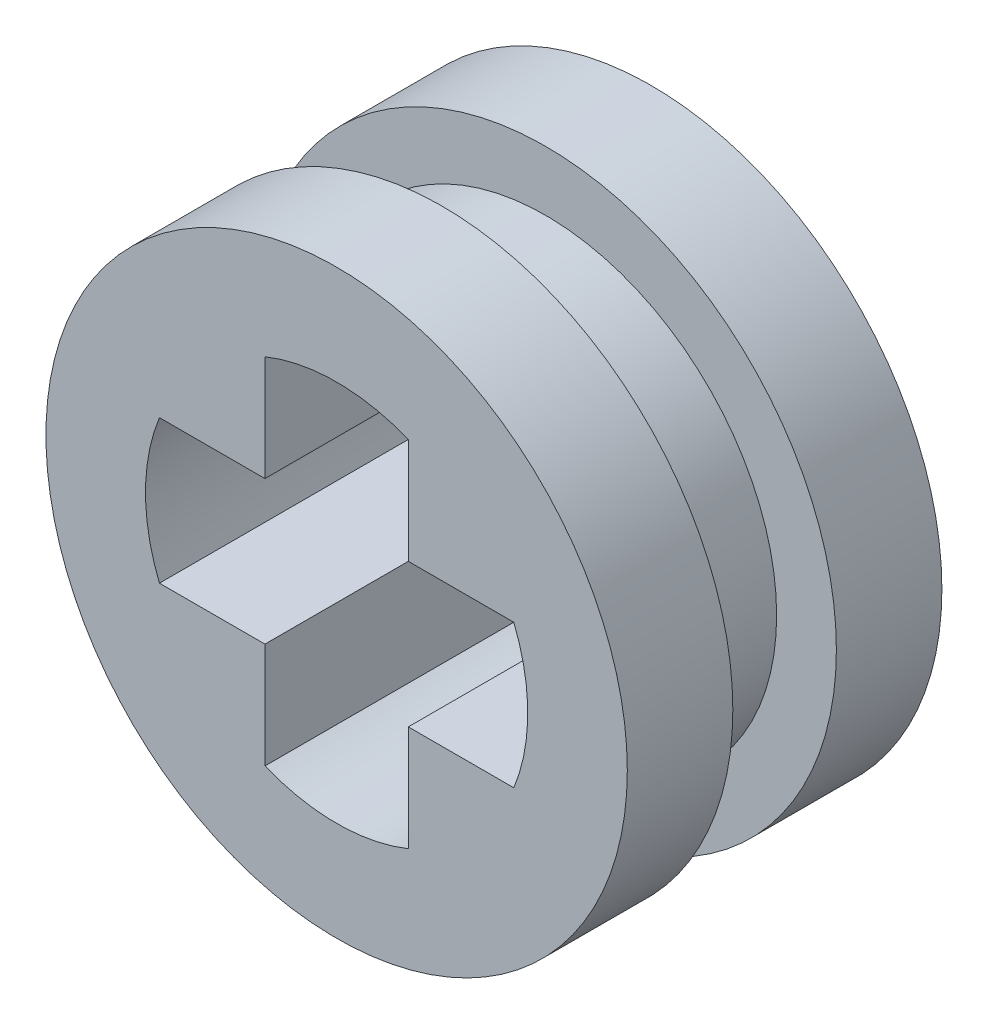
ISO-10303-21;
HEADER;
FILE_DESCRIPTION(('STEP AP214'),'2;1');
FILE_NAME('part.step','',(''),(''),'','','');
FILE_SCHEMA(('AUTOMOTIVE_DESIGN { 1 0 10303 214 1 1 1 1 }'));
ENDSEC;
DATA;
#1=APPLICATION_CONTEXT('core data for automotive mechanical design processes');
#2=APPLICATION_PROTOCOL_DEFINITION('international standard','automotive_design',2000,#1);
#3=PRODUCT_CONTEXT('',#1,'mechanical');
#4=PRODUCT('Part','Part','',(#3));
#5=PRODUCT_RELATED_PRODUCT_CATEGORY('part','',(#4));
#6=PRODUCT_DEFINITION_FORMATION('','',#4);
#7=PRODUCT_DEFINITION_CONTEXT('part definition',#1,'design');
#8=PRODUCT_DEFINITION('design','',#6,#7);
#9=PRODUCT_DEFINITION_SHAPE('','',#8);
#10=(LENGTH_UNIT() NAMED_UNIT(*) SI_UNIT(.MILLI.,.METRE.));
#11=(NAMED_UNIT(*) PLANE_ANGLE_UNIT() SI_UNIT($,.RADIAN.));
#12=(NAMED_UNIT(*) SI_UNIT($,.STERADIAN.) SOLID_ANGLE_UNIT());
#13=UNCERTAINTY_MEASURE_WITH_UNIT(LENGTH_MEASURE(1.E-05),#10,'distance_accuracy_value','');
#14=(GEOMETRIC_REPRESENTATION_CONTEXT(3) GLOBAL_UNCERTAINTY_ASSIGNED_CONTEXT((#13)) GLOBAL_UNIT_ASSIGNED_CONTEXT((#10,
#11,#12)) REPRESENTATION_CONTEXT('',''));
#15=CARTESIAN_POINT('',(0.,0.,0.));
#16=DIRECTION('',(0.,0.,1.));
#17=DIRECTION('',(1.,0.,0.));
#18=AXIS2_PLACEMENT_3D('',#15,#16,#17);
#19=CARTESIAN_POINT('',(0.,0.,1.975));
#20=DIRECTION('',(0.,0.,-1.));
#21=DIRECTION('',(-1.,0.,0.));
#22=AXIS2_PLACEMENT_3D('',#19,#20,#21);
#23=CYLINDRICAL_SURFACE('',#22,3.65);
#24=CARTESIAN_POINT('',(0.,0.,-1.975));
#25=DIRECTION('',(0.,0.,1.));
#26=DIRECTION('',(1.,0.,0.));
#27=AXIS2_PLACEMENT_3D('',#24,#25,#26);
#28=CIRCLE('',#27,3.65);
#29=CARTESIAN_POINT('',(3.65,0.,-1.975));
#30=VERTEX_POINT('',#29);
#31=EDGE_CURVE('E194',#30,#30,#28,.T.);
#32=ORIENTED_EDGE('',*,*,#31,.T.);
#33=EDGE_LOOP('',(#32));
#34=FACE_BOUND('',#33,.T.);
#35=CARTESIAN_POINT('',(0.,0.,-0.65));
#36=DIRECTION('',(0.,0.,1.));
#37=DIRECTION('',(1.,0.,0.));
#38=AXIS2_PLACEMENT_3D('',#35,#36,#37);
#39=CIRCLE('',#38,3.65);
#40=CARTESIAN_POINT('',(3.65,0.,-0.65));
#41=VERTEX_POINT('',#40);
#42=EDGE_CURVE('E40',#41,#41,#39,.T.);
#43=ORIENTED_EDGE('',*,*,#42,.F.);
#44=EDGE_LOOP('',(#43));
#45=FACE_BOUND('',#44,.T.);
#46=ADVANCED_FACE('F36',(#34,#45),#23,.T.);
#47=CARTESIAN_POINT('',(0.,0.9,1.975));
#48=DIRECTION('',(0.,1.,0.));
#49=DIRECTION('',(0.,0.,1.));
#50=AXIS2_PLACEMENT_3D('',#47,#48,#49);
#51=PLANE('',#50);
#52=DIRECTION('',(1.,0.,0.));
#53=VECTOR('',#52,1.);
#54=CARTESIAN_POINT('',(0.,0.9,-1.975));
#55=LINE('',#54,#53);
#56=CARTESIAN_POINT('',(0.9,0.9,-1.975));
#57=VERTEX_POINT('',#56);
#58=CARTESIAN_POINT('',(2.2248595461287,0.9,-1.975));
#59=VERTEX_POINT('',#58);
#60=EDGE_CURVE('E163',#57,#59,#55,.T.);
#61=ORIENTED_EDGE('',*,*,#60,.T.);
#62=DIRECTION('',(0.,0.,-1.));
#63=VECTOR('',#62,1.);
#64=CARTESIAN_POINT('',(2.2248595461287,0.9,1.975));
#65=LINE('',#64,#63);
#66=CARTESIAN_POINT('',(2.2248595461287,0.9,1.975));
#67=VERTEX_POINT('',#66);
#68=EDGE_CURVE('E12',#67,#59,#65,.T.);
#69=ORIENTED_EDGE('',*,*,#68,.F.);
#70=DIRECTION('',(1.,0.,0.));
#71=VECTOR('',#70,1.);
#72=CARTESIAN_POINT('',(0.,0.9,1.975));
#73=LINE('',#72,#71);
#74=CARTESIAN_POINT('',(0.9,0.9,1.975));
#75=VERTEX_POINT('',#74);
#76=EDGE_CURVE('E104',#75,#67,#73,.T.);
#77=ORIENTED_EDGE('',*,*,#76,.F.);
#78=DIRECTION('',(0.,0.,-1.));
#79=VECTOR('',#78,1.);
#80=CARTESIAN_POINT('',(0.9,0.9,1.975));
#81=LINE('',#80,#79);
#82=EDGE_CURVE('E55',#75,#57,#81,.T.);
#83=ORIENTED_EDGE('',*,*,#82,.T.);
#84=EDGE_LOOP('',(#61,#69,#77,#83));
#85=FACE_BOUND('',#84,.T.);
#86=ADVANCED_FACE('F38',(#85),#51,.F.);
#87=CARTESIAN_POINT('',(0.,0.,1.975));
#88=DIRECTION('',(0.,0.,-1.));
#89=DIRECTION('',(-1.,0.,0.));
#90=AXIS2_PLACEMENT_3D('',#87,#88,#89);
#91=CYLINDRICAL_SURFACE('',#90,2.4);
#92=CARTESIAN_POINT('',(0.,0.,-1.975));
#93=DIRECTION('',(0.,0.,1.));
#94=DIRECTION('',(1.,0.,0.));
#95=AXIS2_PLACEMENT_3D('',#92,#93,#94);
#96=CIRCLE('',#95,2.4);
#97=CARTESIAN_POINT('',(2.2248595461287,-0.9,-1.975));
#98=VERTEX_POINT('',#97);
#99=EDGE_CURVE('E165',#98,#59,#96,.T.);
#100=ORIENTED_EDGE('',*,*,#99,.F.);
#101=DIRECTION('',(0.,0.,-1.));
#102=VECTOR('',#101,1.);
#103=CARTESIAN_POINT('',(2.2248595461287,-0.9,1.975));
#104=LINE('',#103,#102);
#105=CARTESIAN_POINT('',(2.2248595461287,-0.9,1.975));
#106=VERTEX_POINT('',#105);
#107=EDGE_CURVE('E46',#106,#98,#104,.T.);
#108=ORIENTED_EDGE('',*,*,#107,.F.);
#109=CARTESIAN_POINT('',(0.,0.,1.975));
#110=DIRECTION('',(0.,0.,1.));
#111=DIRECTION('',(1.,0.,0.));
#112=AXIS2_PLACEMENT_3D('',#109,#110,#111);
#113=CIRCLE('',#112,2.4);
#114=EDGE_CURVE('E227',#106,#67,#113,.T.);
#115=ORIENTED_EDGE('',*,*,#114,.T.);
#116=ORIENTED_EDGE('',*,*,#68,.T.);
#117=EDGE_LOOP('',(#100,#108,#115,#116));
#118=FACE_BOUND('',#117,.T.);
#119=ADVANCED_FACE('F278',(#118),#91,.F.);
#120=CARTESIAN_POINT('',(0.,-0.9,1.975));
#121=DIRECTION('',(0.,1.,0.));
#122=DIRECTION('',(0.,0.,1.));
#123=AXIS2_PLACEMENT_3D('',#120,#121,#122);
#124=PLANE('',#123);
#125=DIRECTION('',(1.,0.,0.));
#126=VECTOR('',#125,1.);
#127=CARTESIAN_POINT('',(0.,-0.9,-1.975));
#128=LINE('',#127,#126);
#129=CARTESIAN_POINT('',(0.9,-0.9,-1.975));
#130=VERTEX_POINT('',#129);
#131=EDGE_CURVE('E168',#130,#98,#128,.T.);
#132=ORIENTED_EDGE('',*,*,#131,.F.);
#133=DIRECTION('',(0.,0.,-1.));
#134=VECTOR('',#133,1.);
#135=CARTESIAN_POINT('',(0.9,-0.9,1.975));
#136=LINE('',#135,#134);
#137=CARTESIAN_POINT('',(0.9,-0.9,1.975));
#138=VERTEX_POINT('',#137);
#139=EDGE_CURVE('E210',#138,#130,#136,.T.);
#140=ORIENTED_EDGE('',*,*,#139,.F.);
#141=DIRECTION('',(1.,0.,0.));
#142=VECTOR('',#141,1.);
#143=CARTESIAN_POINT('',(0.,-0.9,1.975));
#144=LINE('',#143,#142);
#145=EDGE_CURVE('E230',#138,#106,#144,.T.);
#146=ORIENTED_EDGE('',*,*,#145,.T.);
#147=ORIENTED_EDGE('',*,*,#107,.T.);
#148=EDGE_LOOP('',(#132,#140,#146,#147));
#149=FACE_BOUND('',#148,.T.);
#150=ADVANCED_FACE('F301',(#149),#124,.T.);
#151=CARTESIAN_POINT('',(0.9,0.,1.975));
#152=DIRECTION('',(-1.,0.,0.));
#153=DIRECTION('',(0.,0.,1.));
#154=AXIS2_PLACEMENT_3D('',#151,#152,#153);
#155=PLANE('',#154);
#156=DIRECTION('',(0.,1.,0.));
#157=VECTOR('',#156,1.);
#158=CARTESIAN_POINT('',(0.9,0.,-1.975));
#159=LINE('',#158,#157);
#160=CARTESIAN_POINT('',(0.9,-2.2248595461287,-1.975));
#161=VERTEX_POINT('',#160);
#162=EDGE_CURVE('E171',#161,#130,#159,.T.);
#163=ORIENTED_EDGE('',*,*,#162,.F.);
#164=DIRECTION('',(0.,0.,-1.));
#165=VECTOR('',#164,1.);
#166=CARTESIAN_POINT('',(0.9,-2.2248595461287,1.975));
#167=LINE('',#166,#165);
#168=CARTESIAN_POINT('',(0.9,-2.2248595461287,1.975));
#169=VERTEX_POINT('',#168);
#170=EDGE_CURVE('E208',#169,#161,#167,.T.);
#171=ORIENTED_EDGE('',*,*,#170,.F.);
#172=DIRECTION('',(0.,1.,0.));
#173=VECTOR('',#172,1.);
#174=CARTESIAN_POINT('',(0.9,0.,1.975));
#175=LINE('',#174,#173);
#176=EDGE_CURVE('E233',#169,#138,#175,.T.);
#177=ORIENTED_EDGE('',*,*,#176,.T.);
#178=ORIENTED_EDGE('',*,*,#139,.T.);
#179=EDGE_LOOP('',(#163,#171,#177,#178));
#180=FACE_BOUND('',#179,.T.);
#181=ADVANCED_FACE('F304',(#180),#155,.T.);
#182=CARTESIAN_POINT('',(0.,0.,1.975));
#183=DIRECTION('',(0.,0.,-1.));
#184=DIRECTION('',(-1.,0.,0.));
#185=AXIS2_PLACEMENT_3D('',#182,#183,#184);
#186=CYLINDRICAL_SURFACE('',#185,2.4);
#187=CARTESIAN_POINT('',(0.,0.,-1.975));
#188=DIRECTION('',(0.,0.,1.));
#189=DIRECTION('',(1.,0.,0.));
#190=AXIS2_PLACEMENT_3D('',#187,#188,#189);
#191=CIRCLE('',#190,2.4);
#192=CARTESIAN_POINT('',(-0.9,-2.2248595461287,-1.975));
#193=VERTEX_POINT('',#192);
#194=EDGE_CURVE('E174',#193,#161,#191,.T.);
#195=ORIENTED_EDGE('',*,*,#194,.F.);
#196=DIRECTION('',(0.,0.,-1.));
#197=VECTOR('',#196,1.);
#198=CARTESIAN_POINT('',(-0.9,-2.2248595461287,1.975));
#199=LINE('',#198,#197);
#200=CARTESIAN_POINT('',(-0.9,-2.2248595461287,1.975));
#201=VERTEX_POINT('',#200);
#202=EDGE_CURVE('E206',#201,#193,#199,.T.);
#203=ORIENTED_EDGE('',*,*,#202,.F.);
#204=CARTESIAN_POINT('',(0.,0.,1.975));
#205=DIRECTION('',(0.,0.,1.));
#206=DIRECTION('',(1.,0.,0.));
#207=AXIS2_PLACEMENT_3D('',#204,#205,#206);
#208=CIRCLE('',#207,2.4);
#209=EDGE_CURVE('E236',#201,#169,#208,.T.);
#210=ORIENTED_EDGE('',*,*,#209,.T.);
#211=ORIENTED_EDGE('',*,*,#170,.T.);
#212=EDGE_LOOP('',(#195,#203,#210,#211));
#213=FACE_BOUND('',#212,.T.);
#214=ADVANCED_FACE('F307',(#213),#186,.F.);
#215=CARTESIAN_POINT('',(-0.9,0.,1.975));
#216=DIRECTION('',(-1.,0.,0.));
#217=DIRECTION('',(0.,0.,1.));
#218=AXIS2_PLACEMENT_3D('',#215,#216,#217);
#219=PLANE('',#218);
#220=DIRECTION('',(0.,1.,0.));
#221=VECTOR('',#220,1.);
#222=CARTESIAN_POINT('',(-0.9,0.,-1.975));
#223=LINE('',#222,#221);
#224=CARTESIAN_POINT('',(-0.9,-0.9,-1.975));
#225=VERTEX_POINT('',#224);
#226=EDGE_CURVE('E177',#193,#225,#223,.T.);
#227=ORIENTED_EDGE('',*,*,#226,.T.);
#228=DIRECTION('',(0.,0.,-1.));
#229=VECTOR('',#228,1.);
#230=CARTESIAN_POINT('',(-0.9,-0.9,1.975));
#231=LINE('',#230,#229);
#232=CARTESIAN_POINT('',(-0.9,-0.9,1.975));
#233=VERTEX_POINT('',#232);
#234=EDGE_CURVE('E204',#233,#225,#231,.T.);
#235=ORIENTED_EDGE('',*,*,#234,.F.);
#236=DIRECTION('',(0.,1.,0.));
#237=VECTOR('',#236,1.);
#238=CARTESIAN_POINT('',(-0.9,0.,1.975));
#239=LINE('',#238,#237);
#240=EDGE_CURVE('E239',#201,#233,#239,.T.);
#241=ORIENTED_EDGE('',*,*,#240,.F.);
#242=ORIENTED_EDGE('',*,*,#202,.T.);
#243=EDGE_LOOP('',(#227,#235,#241,#242));
#244=FACE_BOUND('',#243,.T.);
#245=ADVANCED_FACE('F309',(#244),#219,.F.);
#246=CARTESIAN_POINT('',(0.,-0.9,1.975));
#247=DIRECTION('',(0.,1.,0.));
#248=DIRECTION('',(0.,0.,1.));
#249=AXIS2_PLACEMENT_3D('',#246,#247,#248);
#250=PLANE('',#249);
#251=DIRECTION('',(1.,0.,0.));
#252=VECTOR('',#251,1.);
#253=CARTESIAN_POINT('',(0.,-0.9,-1.975));
#254=LINE('',#253,#252);
#255=CARTESIAN_POINT('',(-2.2248595461287,-0.9,-1.975));
#256=VERTEX_POINT('',#255);
#257=EDGE_CURVE('E180',#256,#225,#254,.T.);
#258=ORIENTED_EDGE('',*,*,#257,.F.);
#259=DIRECTION('',(0.,0.,-1.));
#260=VECTOR('',#259,1.);
#261=CARTESIAN_POINT('',(-2.2248595461287,-0.9,1.975));
#262=LINE('',#261,#260);
#263=CARTESIAN_POINT('',(-2.2248595461287,-0.9,1.975));
#264=VERTEX_POINT('',#263);
#265=EDGE_CURVE('E202',#264,#256,#262,.T.);
#266=ORIENTED_EDGE('',*,*,#265,.F.);
#267=DIRECTION('',(1.,0.,0.));
#268=VECTOR('',#267,1.);
#269=CARTESIAN_POINT('',(0.,-0.9,1.975));
#270=LINE('',#269,#268);
#271=EDGE_CURVE('E241',#264,#233,#270,.T.);
#272=ORIENTED_EDGE('',*,*,#271,.T.);
#273=ORIENTED_EDGE('',*,*,#234,.T.);
#274=EDGE_LOOP('',(#258,#266,#272,#273));
#275=FACE_BOUND('',#274,.T.);
#276=ADVANCED_FACE('F255',(#275),#250,.T.);
#277=CARTESIAN_POINT('',(0.,0.,1.975));
#278=DIRECTION('',(0.,0.,-1.));
#279=DIRECTION('',(-1.,0.,0.));
#280=AXIS2_PLACEMENT_3D('',#277,#278,#279);
#281=CYLINDRICAL_SURFACE('',#280,2.4);
#282=CARTESIAN_POINT('',(0.,0.,-1.975));
#283=DIRECTION('',(0.,0.,1.));
#284=DIRECTION('',(1.,0.,0.));
#285=AXIS2_PLACEMENT_3D('',#282,#283,#284);
#286=CIRCLE('',#285,2.4);
#287=CARTESIAN_POINT('',(-2.2248595461287,0.9,-1.975));
#288=VERTEX_POINT('',#287);
#289=EDGE_CURVE('E183',#288,#256,#286,.T.);
#290=ORIENTED_EDGE('',*,*,#289,.F.);
#291=DIRECTION('',(0.,0.,-1.));
#292=VECTOR('',#291,1.);
#293=CARTESIAN_POINT('',(-2.2248595461287,0.9,1.975));
#294=LINE('',#293,#292);
#295=CARTESIAN_POINT('',(-2.2248595461287,0.9,1.975));
#296=VERTEX_POINT('',#295);
#297=EDGE_CURVE('E200',#296,#288,#294,.T.);
#298=ORIENTED_EDGE('',*,*,#297,.F.);
#299=CARTESIAN_POINT('',(0.,0.,1.975));
#300=DIRECTION('',(0.,0.,1.));
#301=DIRECTION('',(1.,0.,0.));
#302=AXIS2_PLACEMENT_3D('',#299,#300,#301);
#303=CIRCLE('',#302,2.4);
#304=EDGE_CURVE('E244',#296,#264,#303,.T.);
#305=ORIENTED_EDGE('',*,*,#304,.T.);
#306=ORIENTED_EDGE('',*,*,#265,.T.);
#307=EDGE_LOOP('',(#290,#298,#305,#306));
#308=FACE_BOUND('',#307,.T.);
#309=ADVANCED_FACE('F248',(#308),#281,.F.);
#310=CARTESIAN_POINT('',(0.,0.9,1.975));
#311=DIRECTION('',(0.,1.,0.));
#312=DIRECTION('',(0.,0.,1.));
#313=AXIS2_PLACEMENT_3D('',#310,#311,#312);
#314=PLANE('',#313);
#315=DIRECTION('',(1.,0.,0.));
#316=VECTOR('',#315,1.);
#317=CARTESIAN_POINT('',(0.,0.9,-1.975));
#318=LINE('',#317,#316);
#319=CARTESIAN_POINT('',(-0.9,0.9,-1.975));
#320=VERTEX_POINT('',#319);
#321=EDGE_CURVE('E186',#288,#320,#318,.T.);
#322=ORIENTED_EDGE('',*,*,#321,.T.);
#323=DIRECTION('',(0.,0.,-1.));
#324=VECTOR('',#323,1.);
#325=CARTESIAN_POINT('',(-0.9,0.9,1.975));
#326=LINE('',#325,#324);
#327=CARTESIAN_POINT('',(-0.9,0.9,1.975));
#328=VERTEX_POINT('',#327);
#329=EDGE_CURVE('E152',#328,#320,#326,.T.);
#330=ORIENTED_EDGE('',*,*,#329,.F.);
#331=DIRECTION('',(1.,0.,0.));
#332=VECTOR('',#331,1.);
#333=CARTESIAN_POINT('',(0.,0.9,1.975));
#334=LINE('',#333,#332);
#335=EDGE_CURVE('E140',#296,#328,#334,.T.);
#336=ORIENTED_EDGE('',*,*,#335,.F.);
#337=ORIENTED_EDGE('',*,*,#297,.T.);
#338=EDGE_LOOP('',(#322,#330,#336,#337));
#339=FACE_BOUND('',#338,.T.);
#340=ADVANCED_FACE('F262',(#339),#314,.F.);
#341=CARTESIAN_POINT('',(-0.9,0.,1.975));
#342=DIRECTION('',(-1.,0.,0.));
#343=DIRECTION('',(0.,0.,1.));
#344=AXIS2_PLACEMENT_3D('',#341,#342,#343);
#345=PLANE('',#344);
#346=DIRECTION('',(0.,1.,0.));
#347=VECTOR('',#346,1.);
#348=CARTESIAN_POINT('',(-0.9,0.,-1.975));
#349=LINE('',#348,#347);
#350=CARTESIAN_POINT('',(-0.9,2.2248595461287,-1.975));
#351=VERTEX_POINT('',#350);
#352=EDGE_CURVE('E149',#320,#351,#349,.T.);
#353=ORIENTED_EDGE('',*,*,#352,.T.);
#354=DIRECTION('',(0.,0.,-1.));
#355=VECTOR('',#354,1.);
#356=CARTESIAN_POINT('',(-0.9,2.2248595461287,1.975));
#357=LINE('',#356,#355);
#358=CARTESIAN_POINT('',(-0.9,2.2248595461287,1.975));
#359=VERTEX_POINT('',#358);
#360=EDGE_CURVE('E146',#359,#351,#357,.T.);
#361=ORIENTED_EDGE('',*,*,#360,.F.);
#362=DIRECTION('',(0.,1.,0.));
#363=VECTOR('',#362,1.);
#364=CARTESIAN_POINT('',(-0.9,0.,1.975));
#365=LINE('',#364,#363);
#366=EDGE_CURVE('E132',#328,#359,#365,.T.);
#367=ORIENTED_EDGE('',*,*,#366,.F.);
#368=ORIENTED_EDGE('',*,*,#329,.T.);
#369=EDGE_LOOP('',(#353,#361,#367,#368));
#370=FACE_BOUND('',#369,.T.);
#371=ADVANCED_FACE('F147',(#370),#345,.F.);
#372=CARTESIAN_POINT('',(0.,0.,1.975));
#373=DIRECTION('',(0.,0.,-1.));
#374=DIRECTION('',(-1.,0.,0.));
#375=AXIS2_PLACEMENT_3D('',#372,#373,#374);
#376=CYLINDRICAL_SURFACE('',#375,2.4);
#377=CARTESIAN_POINT('',(0.,0.,-1.975));
#378=DIRECTION('',(0.,0.,1.));
#379=DIRECTION('',(1.,0.,0.));
#380=AXIS2_PLACEMENT_3D('',#377,#378,#379);
#381=CIRCLE('',#380,2.4);
#382=CARTESIAN_POINT('',(0.9,2.2248595461287,-1.975));
#383=VERTEX_POINT('',#382);
#384=EDGE_CURVE('E189',#383,#351,#381,.T.);
#385=ORIENTED_EDGE('',*,*,#384,.F.);
#386=DIRECTION('',(0.,0.,-1.));
#387=VECTOR('',#386,1.);
#388=CARTESIAN_POINT('',(0.9,2.2248595461287,1.975));
#389=LINE('',#388,#387);
#390=CARTESIAN_POINT('',(0.9,2.2248595461287,1.975));
#391=VERTEX_POINT('',#390);
#392=EDGE_CURVE('E92',#391,#383,#389,.T.);
#393=ORIENTED_EDGE('',*,*,#392,.F.);
#394=CARTESIAN_POINT('',(0.,0.,1.975));
#395=DIRECTION('',(0.,0.,1.));
#396=DIRECTION('',(1.,0.,0.));
#397=AXIS2_PLACEMENT_3D('',#394,#395,#396);
#398=CIRCLE('',#397,2.4);
#399=EDGE_CURVE('E137',#391,#359,#398,.T.);
#400=ORIENTED_EDGE('',*,*,#399,.T.);
#401=ORIENTED_EDGE('',*,*,#360,.T.);
#402=EDGE_LOOP('',(#385,#393,#400,#401));
#403=FACE_BOUND('',#402,.T.);
#404=ADVANCED_FACE('F154',(#403),#376,.F.);
#405=CARTESIAN_POINT('',(0.9,0.,1.975));
#406=DIRECTION('',(-1.,0.,0.));
#407=DIRECTION('',(0.,0.,1.));
#408=AXIS2_PLACEMENT_3D('',#405,#406,#407);
#409=PLANE('',#408);
#410=DIRECTION('',(0.,1.,0.));
#411=VECTOR('',#410,1.);
#412=CARTESIAN_POINT('',(0.9,0.,-1.975));
#413=LINE('',#412,#411);
#414=EDGE_CURVE('E191',#57,#383,#413,.T.);
#415=ORIENTED_EDGE('',*,*,#414,.F.);
#416=ORIENTED_EDGE('',*,*,#82,.F.);
#417=DIRECTION('',(0.,1.,0.));
#418=VECTOR('',#417,1.);
#419=CARTESIAN_POINT('',(0.9,0.,1.975));
#420=LINE('',#419,#418);
#421=EDGE_CURVE('E155',#75,#391,#420,.T.);
#422=ORIENTED_EDGE('',*,*,#421,.T.);
#423=ORIENTED_EDGE('',*,*,#392,.T.);
#424=EDGE_LOOP('',(#415,#416,#422,#423));
#425=FACE_BOUND('',#424,.T.);
#426=ADVANCED_FACE('F283',(#425),#409,.T.);
#427=CARTESIAN_POINT('',(0.,0.,0.65));
#428=DIRECTION('',(0.,0.,1.));
#429=DIRECTION('',(1.,0.,0.));
#430=AXIS2_PLACEMENT_3D('',#427,#428,#429);
#431=CIRCLE('',#430,3.65);
#432=CARTESIAN_POINT('',(3.65,0.,0.65));
#433=VERTEX_POINT('',#432);
#434=EDGE_CURVE('E212',#433,#433,#431,.T.);
#435=ORIENTED_EDGE('',*,*,#434,.T.);
#436=EDGE_LOOP('',(#435));
#437=FACE_BOUND('',#436,.T.);
#438=CARTESIAN_POINT('',(0.,0.,1.975));
#439=DIRECTION('',(0.,0.,1.));
#440=DIRECTION('',(1.,0.,0.));
#441=AXIS2_PLACEMENT_3D('',#438,#439,#440);
#442=CIRCLE('',#441,3.65);
#443=CARTESIAN_POINT('',(3.65,0.,1.975));
#444=VERTEX_POINT('',#443);
#445=EDGE_CURVE('E157',#444,#444,#442,.T.);
#446=ORIENTED_EDGE('',*,*,#445,.F.);
#447=EDGE_LOOP('',(#446));
#448=FACE_BOUND('',#447,.T.);
#449=ADVANCED_FACE('F274',(#437,#448),#23,.T.);
#450=CARTESIAN_POINT('',(0.,0.,1.975));
#451=DIRECTION('',(0.,0.,1.));
#452=DIRECTION('',(1.,0.,0.));
#453=AXIS2_PLACEMENT_3D('',#450,#451,#452);
#454=PLANE('',#453);
#455=ORIENTED_EDGE('',*,*,#76,.T.);
#456=ORIENTED_EDGE('',*,*,#114,.F.);
#457=ORIENTED_EDGE('',*,*,#145,.F.);
#458=ORIENTED_EDGE('',*,*,#176,.F.);
#459=ORIENTED_EDGE('',*,*,#209,.F.);
#460=ORIENTED_EDGE('',*,*,#240,.T.);
#461=ORIENTED_EDGE('',*,*,#271,.F.);
#462=ORIENTED_EDGE('',*,*,#304,.F.);
#463=ORIENTED_EDGE('',*,*,#335,.T.);
#464=ORIENTED_EDGE('',*,*,#366,.T.);
#465=ORIENTED_EDGE('',*,*,#399,.F.);
#466=ORIENTED_EDGE('',*,*,#421,.F.);
#467=EDGE_LOOP('',(#455,#456,#457,#458,#459,#460,#461,#462,#463,#464,#465,#466));
#468=FACE_BOUND('',#467,.T.);
#469=ORIENTED_EDGE('',*,*,#445,.T.);
#470=EDGE_LOOP('',(#469));
#471=FACE_BOUND('',#470,.T.);
#472=ADVANCED_FACE('F134',(#468,#471),#454,.T.);
#473=CARTESIAN_POINT('',(0.,0.,-1.975));
#474=DIRECTION('',(0.,0.,1.));
#475=DIRECTION('',(1.,0.,0.));
#476=AXIS2_PLACEMENT_3D('',#473,#474,#475);
#477=PLANE('',#476);
#478=ORIENTED_EDGE('',*,*,#60,.F.);
#479=ORIENTED_EDGE('',*,*,#414,.T.);
#480=ORIENTED_EDGE('',*,*,#384,.T.);
#481=ORIENTED_EDGE('',*,*,#352,.F.);
#482=ORIENTED_EDGE('',*,*,#321,.F.);
#483=ORIENTED_EDGE('',*,*,#289,.T.);
#484=ORIENTED_EDGE('',*,*,#257,.T.);
#485=ORIENTED_EDGE('',*,*,#226,.F.);
#486=ORIENTED_EDGE('',*,*,#194,.T.);
#487=ORIENTED_EDGE('',*,*,#162,.T.);
#488=ORIENTED_EDGE('',*,*,#131,.T.);
#489=ORIENTED_EDGE('',*,*,#99,.T.);
#490=EDGE_LOOP('',(#478,#479,#480,#481,#482,#483,#484,#485,#486,#487,#488,#489));
#491=FACE_BOUND('',#490,.T.);
#492=ORIENTED_EDGE('',*,*,#31,.F.);
#493=EDGE_LOOP('',(#492));
#494=FACE_BOUND('',#493,.T.);
#495=ADVANCED_FACE('F259',(#491,#494),#477,.F.);
#496=CARTESIAN_POINT('',(0.,0.,-0.65));
#497=DIRECTION('',(0.,0.,1.));
#498=DIRECTION('',(1.,0.,0.));
#499=AXIS2_PLACEMENT_3D('',#496,#497,#498);
#500=PLANE('',#499);
#501=CARTESIAN_POINT('',(0.,0.,-0.65));
#502=DIRECTION('',(0.,0.,1.));
#503=DIRECTION('',(1.,0.,0.));
#504=AXIS2_PLACEMENT_3D('',#501,#502,#503);
#505=CIRCLE('',#504,2.9);
#506=CARTESIAN_POINT('',(2.9,0.,-0.65));
#507=VERTEX_POINT('',#506);
#508=EDGE_CURVE('E214',#507,#507,#505,.T.);
#509=ORIENTED_EDGE('',*,*,#508,.F.);
#510=EDGE_LOOP('',(#509));
#511=FACE_BOUND('',#510,.T.);
#512=ORIENTED_EDGE('',*,*,#42,.T.);
#513=EDGE_LOOP('',(#512));
#514=FACE_BOUND('',#513,.T.);
#515=ADVANCED_FACE('F392',(#511,#514),#500,.T.);
#516=CARTESIAN_POINT('',(0.,0.,0.65));
#517=DIRECTION('',(0.,0.,1.));
#518=DIRECTION('',(1.,0.,0.));
#519=AXIS2_PLACEMENT_3D('',#516,#517,#518);
#520=PLANE('',#519);
#521=CARTESIAN_POINT('',(0.,0.,0.65));
#522=DIRECTION('',(0.,0.,1.));
#523=DIRECTION('',(1.,0.,0.));
#524=AXIS2_PLACEMENT_3D('',#521,#522,#523);
#525=CIRCLE('',#524,2.9);
#526=CARTESIAN_POINT('',(2.9,0.,0.65));
#527=VERTEX_POINT('',#526);
#528=EDGE_CURVE('E219',#527,#527,#525,.T.);
#529=ORIENTED_EDGE('',*,*,#528,.T.);
#530=EDGE_LOOP('',(#529));
#531=FACE_BOUND('',#530,.T.);
#532=ORIENTED_EDGE('',*,*,#434,.F.);
#533=EDGE_LOOP('',(#532));
#534=FACE_BOUND('',#533,.T.);
#535=ADVANCED_FACE('F410',(#531,#534),#520,.F.);
#536=CARTESIAN_POINT('',(0.,0.,-0.65));
#537=DIRECTION('',(0.,0.,1.));
#538=DIRECTION('',(1.,0.,0.));
#539=AXIS2_PLACEMENT_3D('',#536,#537,#538);
#540=CYLINDRICAL_SURFACE('',#539,2.9);
#541=ORIENTED_EDGE('',*,*,#508,.T.);
#542=EDGE_LOOP('',(#541));
#543=FACE_BOUND('',#542,.T.);
#544=ORIENTED_EDGE('',*,*,#528,.F.);
#545=EDGE_LOOP('',(#544));
#546=FACE_BOUND('',#545,.T.);
#547=ADVANCED_FACE('F420',(#543,#546),#540,.T.);
#548=CLOSED_SHELL('',(#46,#86,#119,#150,#181,#214,#245,#276,#309,#340,#371,#404,#426,#449,#472,
#495,#515,#535,#547));
#549=MANIFOLD_SOLID_BREP('B2',#548);
#550=ADVANCED_BREP_SHAPE_REPRESENTATION('',(#18,#549),#14);
#551=SHAPE_DEFINITION_REPRESENTATION(#9,#550);
ENDSEC;
END-ISO-10303-21;
